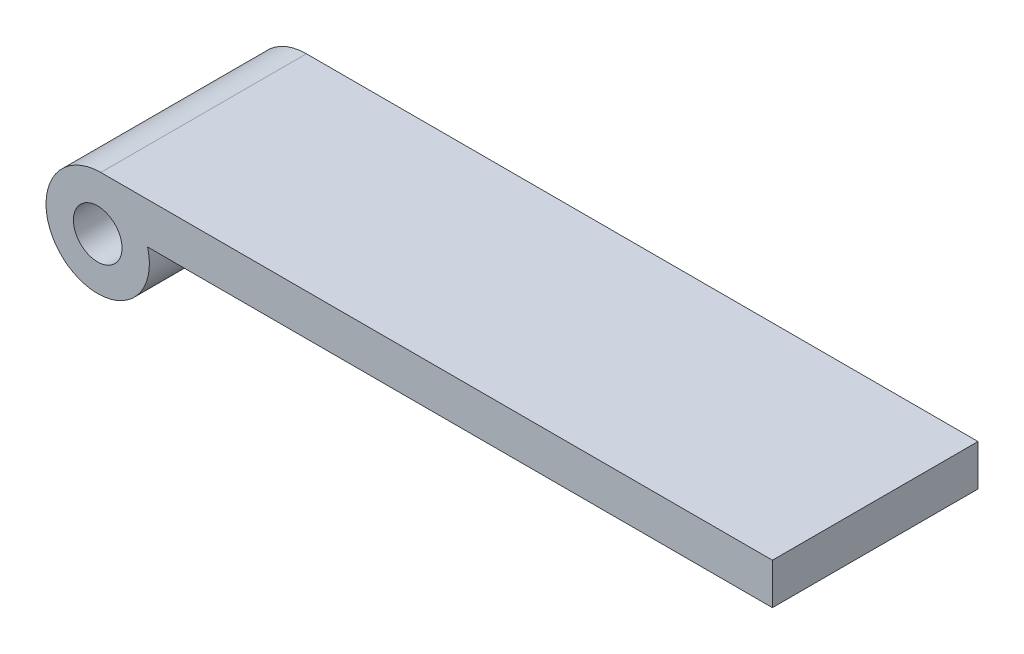
ISO-10303-21;
HEADER;
FILE_DESCRIPTION(('STEP AP214'),'2;1');
FILE_NAME('part.step','',(''),(''),'','','');
FILE_SCHEMA(('AUTOMOTIVE_DESIGN { 1 0 10303 214 1 1 1 1 }'));
ENDSEC;
DATA;
#1=APPLICATION_CONTEXT('core data for automotive mechanical design processes');
#2=APPLICATION_PROTOCOL_DEFINITION('international standard','automotive_design',2000,#1);
#3=PRODUCT_CONTEXT('',#1,'mechanical');
#4=PRODUCT('Part','Part','',(#3));
#5=PRODUCT_RELATED_PRODUCT_CATEGORY('part','',(#4));
#6=PRODUCT_DEFINITION_FORMATION('','',#4);
#7=PRODUCT_DEFINITION_CONTEXT('part definition',#1,'design');
#8=PRODUCT_DEFINITION('design','',#6,#7);
#9=PRODUCT_DEFINITION_SHAPE('','',#8);
#10=(LENGTH_UNIT() NAMED_UNIT(*) SI_UNIT(.MILLI.,.METRE.));
#11=(NAMED_UNIT(*) PLANE_ANGLE_UNIT() SI_UNIT($,.RADIAN.));
#12=(NAMED_UNIT(*) SI_UNIT($,.STERADIAN.) SOLID_ANGLE_UNIT());
#13=UNCERTAINTY_MEASURE_WITH_UNIT(LENGTH_MEASURE(1.E-05),#10,'distance_accuracy_value','');
#14=(GEOMETRIC_REPRESENTATION_CONTEXT(3) GLOBAL_UNCERTAINTY_ASSIGNED_CONTEXT((#13)) GLOBAL_UNIT_ASSIGNED_CONTEXT((#10,
#11,#12)) REPRESENTATION_CONTEXT('',''));
#15=CARTESIAN_POINT('',(0.,0.,0.));
#16=DIRECTION('',(0.,0.,1.));
#17=DIRECTION('',(1.,0.,0.));
#18=AXIS2_PLACEMENT_3D('',#15,#16,#17);
#19=CARTESIAN_POINT('',(-16.8275,5.08,-4.7625));
#20=DIRECTION('',(0.,0.,1.));
#21=DIRECTION('',(1.,0.,0.));
#22=AXIS2_PLACEMENT_3D('',#19,#20,#21);
#23=PLANE('',#22);
#24=CARTESIAN_POINT('',(-14.4325,2.54,-4.7625));
#25=DIRECTION('',(0.,0.,1.));
#26=DIRECTION('',(1.,0.,0.));
#27=AXIS2_PLACEMENT_3D('',#24,#25,#26);
#28=CIRCLE('',#27,1.125);
#29=CARTESIAN_POINT('',(-13.3075,2.54,-4.7625));
#30=VERTEX_POINT('',#29);
#31=EDGE_CURVE('E107',#30,#30,#28,.T.);
#32=ORIENTED_EDGE('',*,*,#31,.T.);
#33=EDGE_LOOP('',(#32));
#34=FACE_BOUND('',#33,.T.);
#35=CARTESIAN_POINT('',(-14.4325,2.54,-4.7625));
#36=DIRECTION('',(0.,0.,1.));
#37=DIRECTION('',(1.,0.,0.));
#38=AXIS2_PLACEMENT_3D('',#35,#36,#37);
#39=CIRCLE('',#38,2.395);
#40=CARTESIAN_POINT('',(-16.8275,2.54,-4.7625));
#41=VERTEX_POINT('',#40);
#42=CARTESIAN_POINT('',(-12.1232143961822,3.175,-4.7625));
#43=VERTEX_POINT('',#42);
#44=EDGE_CURVE('E79',#41,#43,#39,.T.);
#45=ORIENTED_EDGE('',*,*,#44,.F.);
#46=CARTESIAN_POINT('',(-14.2875,2.54,-4.7625));
#47=DIRECTION('',(0.,0.,1.));
#48=DIRECTION('',(1.,0.,0.));
#49=AXIS2_PLACEMENT_3D('',#46,#47,#48);
#50=CIRCLE('',#49,2.54);
#51=CARTESIAN_POINT('',(-14.2875,5.08,-4.7625));
#52=VERTEX_POINT('',#51);
#53=EDGE_CURVE('E42',#41,#52,#50,.F.);
#54=ORIENTED_EDGE('',*,*,#53,.T.);
#55=DIRECTION('',(-1.,0.,0.));
#56=VECTOR('',#55,1.);
#57=CARTESIAN_POINT('',(-16.8275,5.08,-4.7625));
#58=LINE('',#57,#56);
#59=CARTESIAN_POINT('',(16.8275,5.08,-4.7625));
#60=VERTEX_POINT('',#59);
#61=EDGE_CURVE('E102',#60,#52,#58,.T.);
#62=ORIENTED_EDGE('',*,*,#61,.F.);
#63=DIRECTION('',(0.,-1.,0.));
#64=VECTOR('',#63,1.);
#65=CARTESIAN_POINT('',(16.8275,5.08,-4.7625));
#66=LINE('',#65,#64);
#67=CARTESIAN_POINT('',(16.8275,3.175,-4.7625));
#68=VERTEX_POINT('',#67);
#69=EDGE_CURVE('E93',#60,#68,#66,.T.);
#70=ORIENTED_EDGE('',*,*,#69,.T.);
#71=DIRECTION('',(-1.,0.,0.));
#72=VECTOR('',#71,1.);
#73=CARTESIAN_POINT('',(0.,3.175,-4.7625));
#74=LINE('',#73,#72);
#75=EDGE_CURVE('E87',#68,#43,#74,.T.);
#76=ORIENTED_EDGE('',*,*,#75,.T.);
#77=EDGE_LOOP('',(#45,#54,#62,#70,#76));
#78=FACE_BOUND('',#77,.T.);
#79=ADVANCED_FACE('F33',(#34,#78),#23,.F.);
#80=CARTESIAN_POINT('',(-16.8275,5.08,4.7625));
#81=DIRECTION('',(0.,0.,-1.));
#82=DIRECTION('',(-1.,0.,0.));
#83=AXIS2_PLACEMENT_3D('',#80,#81,#82);
#84=PLANE('',#83);
#85=CARTESIAN_POINT('',(-14.4325,2.54,4.7625));
#86=DIRECTION('',(0.,0.,1.));
#87=DIRECTION('',(1.,0.,0.));
#88=AXIS2_PLACEMENT_3D('',#85,#86,#87);
#89=CIRCLE('',#88,1.125);
#90=CARTESIAN_POINT('',(-13.3075,2.54,4.7625));
#91=VERTEX_POINT('',#90);
#92=EDGE_CURVE('E83',#91,#91,#89,.T.);
#93=ORIENTED_EDGE('',*,*,#92,.F.);
#94=EDGE_LOOP('',(#93));
#95=FACE_BOUND('',#94,.T.);
#96=CARTESIAN_POINT('',(-14.4325,2.54,4.7625));
#97=DIRECTION('',(0.,0.,1.));
#98=DIRECTION('',(1.,0.,0.));
#99=AXIS2_PLACEMENT_3D('',#96,#97,#98);
#100=CIRCLE('',#99,2.395);
#101=CARTESIAN_POINT('',(-16.8275,2.54,4.7625));
#102=VERTEX_POINT('',#101);
#103=CARTESIAN_POINT('',(-12.1232143961822,3.175,4.7625));
#104=VERTEX_POINT('',#103);
#105=EDGE_CURVE('E56',#102,#104,#100,.T.);
#106=ORIENTED_EDGE('',*,*,#105,.T.);
#107=DIRECTION('',(-1.,0.,0.));
#108=VECTOR('',#107,1.);
#109=CARTESIAN_POINT('',(0.,3.175,4.7625));
#110=LINE('',#109,#108);
#111=CARTESIAN_POINT('',(16.8275,3.175,4.7625));
#112=VERTEX_POINT('',#111);
#113=EDGE_CURVE('E88',#112,#104,#110,.T.);
#114=ORIENTED_EDGE('',*,*,#113,.F.);
#115=DIRECTION('',(0.,-1.,0.));
#116=VECTOR('',#115,1.);
#117=CARTESIAN_POINT('',(16.8275,5.08,4.7625));
#118=LINE('',#117,#116);
#119=CARTESIAN_POINT('',(16.8275,5.08,4.7625));
#120=VERTEX_POINT('',#119);
#121=EDGE_CURVE('E97',#120,#112,#118,.T.);
#122=ORIENTED_EDGE('',*,*,#121,.F.);
#123=DIRECTION('',(1.,0.,0.));
#124=VECTOR('',#123,1.);
#125=CARTESIAN_POINT('',(-16.8275,5.08,4.7625));
#126=LINE('',#125,#124);
#127=CARTESIAN_POINT('',(-14.2875,5.08,4.7625));
#128=VERTEX_POINT('',#127);
#129=EDGE_CURVE('E100',#128,#120,#126,.T.);
#130=ORIENTED_EDGE('',*,*,#129,.F.);
#131=CARTESIAN_POINT('',(-14.2875,2.54,4.7625));
#132=DIRECTION('',(0.,0.,-1.));
#133=DIRECTION('',(-1.,0.,0.));
#134=AXIS2_PLACEMENT_3D('',#131,#132,#133);
#135=CIRCLE('',#134,2.54);
#136=EDGE_CURVE('E91',#128,#102,#135,.F.);
#137=ORIENTED_EDGE('',*,*,#136,.T.);
#138=EDGE_LOOP('',(#106,#114,#122,#130,#137));
#139=FACE_BOUND('',#138,.T.);
#140=ADVANCED_FACE('F120',(#95,#139),#84,.F.);
#141=CARTESIAN_POINT('',(16.8275,5.08,-4.7625));
#142=DIRECTION('',(-1.,0.,0.));
#143=DIRECTION('',(0.,0.,1.));
#144=AXIS2_PLACEMENT_3D('',#141,#142,#143);
#145=PLANE('',#144);
#146=ORIENTED_EDGE('',*,*,#121,.T.);
#147=DIRECTION('',(0.,0.,1.));
#148=VECTOR('',#147,1.);
#149=CARTESIAN_POINT('',(16.8275,3.175,-4.7625));
#150=LINE('',#149,#148);
#151=EDGE_CURVE('E112',#68,#112,#150,.T.);
#152=ORIENTED_EDGE('',*,*,#151,.F.);
#153=ORIENTED_EDGE('',*,*,#69,.F.);
#154=DIRECTION('',(0.,0.,-1.));
#155=VECTOR('',#154,1.);
#156=CARTESIAN_POINT('',(16.8275,5.08,-4.7625));
#157=LINE('',#156,#155);
#158=EDGE_CURVE('E104',#120,#60,#157,.T.);
#159=ORIENTED_EDGE('',*,*,#158,.F.);
#160=EDGE_LOOP('',(#146,#152,#153,#159));
#161=FACE_BOUND('',#160,.T.);
#162=ADVANCED_FACE('F129',(#161),#145,.F.);
#163=CARTESIAN_POINT('',(0.,5.08,0.));
#164=DIRECTION('',(0.,1.,0.));
#165=DIRECTION('',(0.,0.,1.));
#166=AXIS2_PLACEMENT_3D('',#163,#164,#165);
#167=PLANE('',#166);
#168=ORIENTED_EDGE('',*,*,#61,.T.);
#169=DIRECTION('',(0.,0.,1.));
#170=VECTOR('',#169,1.);
#171=CARTESIAN_POINT('',(-14.2875,5.08,4.7625));
#172=LINE('',#171,#170);
#173=EDGE_CURVE('E11',#52,#128,#172,.T.);
#174=ORIENTED_EDGE('',*,*,#173,.T.);
#175=ORIENTED_EDGE('',*,*,#129,.T.);
#176=ORIENTED_EDGE('',*,*,#158,.T.);
#177=EDGE_LOOP('',(#168,#174,#175,#176));
#178=FACE_BOUND('',#177,.T.);
#179=ADVANCED_FACE('F125',(#178),#167,.T.);
#180=CARTESIAN_POINT('',(-14.4325,2.54,-4.7625));
#181=DIRECTION('',(0.,0.,1.));
#182=DIRECTION('',(1.,0.,0.));
#183=AXIS2_PLACEMENT_3D('',#180,#181,#182);
#184=CYLINDRICAL_SURFACE('',#183,1.125);
#185=CARTESIAN_POINT('',(-13.3075,2.54,-4.7625));
#186=CARTESIAN_POINT('',(-13.3075,2.54,-4.66328125));
#187=CARTESIAN_POINT('',(-13.3075,2.54,-4.5640625));
#188=CARTESIAN_POINT('',(-13.3075,2.54,-4.365625));
#189=CARTESIAN_POINT('',(-13.3075,2.54,-4.26640625));
#190=CARTESIAN_POINT('',(-13.3075,2.54,-4.06796875));
#191=CARTESIAN_POINT('',(-13.3075,2.54,-3.96875));
#192=CARTESIAN_POINT('',(-13.3075,2.54,-3.7703125));
#193=CARTESIAN_POINT('',(-13.3075,2.54,-3.67109375));
#194=CARTESIAN_POINT('',(-13.3075,2.54,-3.47265625));
#195=CARTESIAN_POINT('',(-13.3075,2.54,-3.3734375));
#196=CARTESIAN_POINT('',(-13.3075,2.54,-3.175));
#197=CARTESIAN_POINT('',(-13.3075,2.54,-3.07578125));
#198=CARTESIAN_POINT('',(-13.3075,2.54,-2.87734375));
#199=CARTESIAN_POINT('',(-13.3075,2.54,-2.778125));
#200=CARTESIAN_POINT('',(-13.3075,2.54,-2.5796875));
#201=CARTESIAN_POINT('',(-13.3075,2.54,-2.48046875));
#202=CARTESIAN_POINT('',(-13.3075,2.54,-2.28203125));
#203=CARTESIAN_POINT('',(-13.3075,2.54,-2.1828125));
#204=CARTESIAN_POINT('',(-13.3075,2.54,-1.984375));
#205=CARTESIAN_POINT('',(-13.3075,2.54,-1.88515625));
#206=CARTESIAN_POINT('',(-13.3075,2.54,-1.68671875));
#207=CARTESIAN_POINT('',(-13.3075,2.54,-1.5875));
#208=CARTESIAN_POINT('',(-13.3075,2.54,-1.3890625));
#209=CARTESIAN_POINT('',(-13.3075,2.54,-1.28984375));
#210=CARTESIAN_POINT('',(-13.3075,2.54,-1.09140625));
#211=CARTESIAN_POINT('',(-13.3075,2.54,-0.9921875));
#212=CARTESIAN_POINT('',(-13.3075,2.54,-0.793750000000001));
#213=CARTESIAN_POINT('',(-13.3075,2.54,-0.694531250000001));
#214=CARTESIAN_POINT('',(-13.3075,2.54,-0.496093750000001));
#215=CARTESIAN_POINT('',(-13.3075,2.54,-0.396875000000001));
#216=CARTESIAN_POINT('',(-13.3075,2.54,-0.198437500000001));
#217=CARTESIAN_POINT('',(-13.3075,2.54,-0.0992187500000009));
#218=CARTESIAN_POINT('',(-13.3075,2.54,0.0992187499999992));
#219=CARTESIAN_POINT('',(-13.3075,2.54,0.198437499999999));
#220=CARTESIAN_POINT('',(-13.3075,2.54,0.396874999999999));
#221=CARTESIAN_POINT('',(-13.3075,2.54,0.496093749999999));
#222=CARTESIAN_POINT('',(-13.3075,2.54,0.694531249999999));
#223=CARTESIAN_POINT('',(-13.3075,2.54,0.79375));
#224=CARTESIAN_POINT('',(-13.3075,2.54,0.9921875));
#225=CARTESIAN_POINT('',(-13.3075,2.54,1.09140625));
#226=CARTESIAN_POINT('',(-13.3075,2.54,1.28984375));
#227=CARTESIAN_POINT('',(-13.3075,2.54,1.3890625));
#228=CARTESIAN_POINT('',(-13.3075,2.54,1.5875));
#229=CARTESIAN_POINT('',(-13.3075,2.54,1.68671875));
#230=CARTESIAN_POINT('',(-13.3075,2.54,1.88515625));
#231=CARTESIAN_POINT('',(-13.3075,2.54,1.984375));
#232=CARTESIAN_POINT('',(-13.3075,2.54,2.1828125));
#233=CARTESIAN_POINT('',(-13.3075,2.54,2.28203125));
#234=CARTESIAN_POINT('',(-13.3075,2.54,2.48046875));
#235=CARTESIAN_POINT('',(-13.3075,2.54,2.5796875));
#236=CARTESIAN_POINT('',(-13.3075,2.54,2.778125));
#237=CARTESIAN_POINT('',(-13.3075,2.54,2.87734375));
#238=CARTESIAN_POINT('',(-13.3075,2.54,3.07578125));
#239=CARTESIAN_POINT('',(-13.3075,2.54,3.175));
#240=CARTESIAN_POINT('',(-13.3075,2.54,3.3734375));
#241=CARTESIAN_POINT('',(-13.3075,2.54,3.47265625));
#242=CARTESIAN_POINT('',(-13.3075,2.54,3.67109375));
#243=CARTESIAN_POINT('',(-13.3075,2.54,3.7703125));
#244=CARTESIAN_POINT('',(-13.3075,2.54,3.96875));
#245=CARTESIAN_POINT('',(-13.3075,2.54,4.06796875));
#246=CARTESIAN_POINT('',(-13.3075,2.54,4.26640625));
#247=CARTESIAN_POINT('',(-13.3075,2.54,4.365625));
#248=CARTESIAN_POINT('',(-13.3075,2.54,4.5640625));
#249=CARTESIAN_POINT('',(-13.3075,2.54,4.66328125));
#250=CARTESIAN_POINT('',(-13.3075,2.54,4.7625));
#251=B_SPLINE_CURVE_WITH_KNOTS('',3,(#185,#186,#187,#188,#189,#190,#191,#192,#193,#194,#195,
#196,#197,#198,#199,#200,#201,#202,#203,#204,#205,#206,#207,#208,#209,#210,#211,#212,#213,#214,
#215,#216,#217,#218,#219,#220,#221,#222,#223,#224,#225,#226,#227,#228,#229,#230,#231,#232,#233,
#234,#235,#236,#237,#238,#239,#240,#241,#242,#243,#244,#245,#246,#247,#248,#249,#250),
.UNSPECIFIED.,.F.,.F.,(4,2,2,2,2,2,2,2,2,2,2,2,2,2,2,2,2,2,2,2,2,2,2,2,2,2,2,2,2,2,2,2,4),(0.,
0.29765625,0.5953125,0.892968750000001,1.190625,1.48828125,1.7859375,2.08359375,2.38125,
2.67890625,2.9765625,3.27421875,3.571875,3.86953125,4.1671875,4.46484375,4.7625,5.06015625,
5.3578125,5.65546875,5.953125,6.25078125,6.5484375,6.84609375,7.14375,7.44140625,7.7390625,
8.03671875,8.334375,8.63203125,8.9296875,9.22734375,9.525),.UNSPECIFIED.);
#252=EDGE_CURVE('BSEAM153',#30,#91,#251,.T.);
#253=ORIENTED_EDGE('',*,*,#31,.F.);
#254=ORIENTED_EDGE('',*,*,#92,.T.);
#255=ORIENTED_EDGE('',*,*,#252,.T.);
#256=ORIENTED_EDGE('',*,*,#252,.F.);
#257=EDGE_LOOP('',(#253,#255,#254,#256));
#258=FACE_BOUND('',#257,.T.);
#259=ADVANCED_FACE('F153',(#258),#184,.F.);
#260=CARTESIAN_POINT('',(-14.2875,2.54,0.));
#261=DIRECTION('',(0.,0.,-1.));
#262=DIRECTION('',(-1.,0.,0.));
#263=AXIS2_PLACEMENT_3D('',#260,#261,#262);
#264=CYLINDRICAL_SURFACE('',#263,2.54);
#265=ORIENTED_EDGE('',*,*,#173,.F.);
#266=ORIENTED_EDGE('',*,*,#53,.F.);
#267=DIRECTION('',(0.,0.,1.));
#268=VECTOR('',#267,1.);
#269=CARTESIAN_POINT('',(-16.8275,2.54,-4.7625));
#270=LINE('',#269,#268);
#271=EDGE_CURVE('E37',#102,#41,#270,.F.);
#272=ORIENTED_EDGE('',*,*,#271,.F.);
#273=ORIENTED_EDGE('',*,*,#136,.F.);
#274=EDGE_LOOP('',(#265,#266,#272,#273));
#275=FACE_BOUND('',#274,.T.);
#276=ADVANCED_FACE('F35',(#275),#264,.T.);
#277=CARTESIAN_POINT('',(-14.4325,2.54,-4.7625));
#278=DIRECTION('',(0.,0.,1.));
#279=DIRECTION('',(1.,0.,0.));
#280=AXIS2_PLACEMENT_3D('',#277,#278,#279);
#281=CYLINDRICAL_SURFACE('',#280,2.395);
#282=ORIENTED_EDGE('',*,*,#105,.F.);
#283=ORIENTED_EDGE('',*,*,#271,.T.);
#284=ORIENTED_EDGE('',*,*,#44,.T.);
#285=DIRECTION('',(0.,0.,1.));
#286=VECTOR('',#285,1.);
#287=CARTESIAN_POINT('',(-12.1232143961822,3.175,-4.7625));
#288=LINE('',#287,#286);
#289=EDGE_CURVE('E84',#43,#104,#288,.T.);
#290=ORIENTED_EDGE('',*,*,#289,.T.);
#291=EDGE_LOOP('',(#282,#283,#284,#290));
#292=FACE_BOUND('',#291,.T.);
#293=ADVANCED_FACE('F78',(#292),#281,.T.);
#294=CARTESIAN_POINT('',(0.,3.175,-4.7625));
#295=DIRECTION('',(0.,1.,0.));
#296=DIRECTION('',(0.,0.,1.));
#297=AXIS2_PLACEMENT_3D('',#294,#295,#296);
#298=PLANE('',#297);
#299=ORIENTED_EDGE('',*,*,#113,.T.);
#300=ORIENTED_EDGE('',*,*,#289,.F.);
#301=ORIENTED_EDGE('',*,*,#75,.F.);
#302=ORIENTED_EDGE('',*,*,#151,.T.);
#303=EDGE_LOOP('',(#299,#300,#301,#302));
#304=FACE_BOUND('',#303,.T.);
#305=ADVANCED_FACE('F131',(#304),#298,.F.);
#306=CLOSED_SHELL('',(#79,#140,#162,#179,#259,#276,#293,#305));
#307=MANIFOLD_SOLID_BREP('B2',#306);
#308=ADVANCED_BREP_SHAPE_REPRESENTATION('',(#18,#307),#14);
#309=SHAPE_DEFINITION_REPRESENTATION(#9,#308);
ENDSEC;
END-ISO-10303-21;
